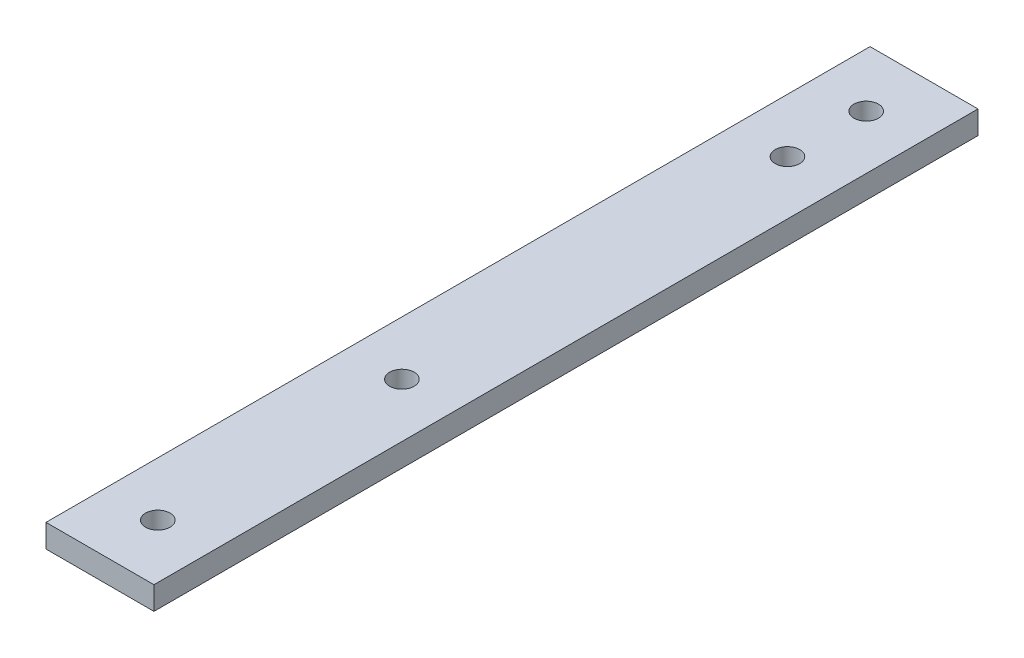
ISO-10303-21;
HEADER;
FILE_DESCRIPTION(('STEP AP214'),'2;1');
FILE_NAME('part.step','',(''),(''),'','','');
FILE_SCHEMA(('AUTOMOTIVE_DESIGN { 1 0 10303 214 1 1 1 1 }'));
ENDSEC;
DATA;
#1=APPLICATION_CONTEXT('core data for automotive mechanical design processes');
#2=APPLICATION_PROTOCOL_DEFINITION('international standard','automotive_design',2000,#1);
#3=PRODUCT_CONTEXT('',#1,'mechanical');
#4=PRODUCT('Part','Part','',(#3));
#5=PRODUCT_RELATED_PRODUCT_CATEGORY('part','',(#4));
#6=PRODUCT_DEFINITION_FORMATION('','',#4);
#7=PRODUCT_DEFINITION_CONTEXT('part definition',#1,'design');
#8=PRODUCT_DEFINITION('design','',#6,#7);
#9=PRODUCT_DEFINITION_SHAPE('','',#8);
#10=(LENGTH_UNIT() NAMED_UNIT(*) SI_UNIT(.MILLI.,.METRE.));
#11=(NAMED_UNIT(*) PLANE_ANGLE_UNIT() SI_UNIT($,.RADIAN.));
#12=(NAMED_UNIT(*) SI_UNIT($,.STERADIAN.) SOLID_ANGLE_UNIT());
#13=UNCERTAINTY_MEASURE_WITH_UNIT(LENGTH_MEASURE(1.E-05),#10,'distance_accuracy_value','');
#14=(GEOMETRIC_REPRESENTATION_CONTEXT(3) GLOBAL_UNCERTAINTY_ASSIGNED_CONTEXT((#13)) GLOBAL_UNIT_ASSIGNED_CONTEXT((#10,
#11,#12)) REPRESENTATION_CONTEXT('',''));
#15=CARTESIAN_POINT('',(0.,0.,0.));
#16=DIRECTION('',(0.,0.,1.));
#17=DIRECTION('',(1.,0.,0.));
#18=AXIS2_PLACEMENT_3D('',#15,#16,#17);
#19=CARTESIAN_POINT('',(14.,3.,0.));
#20=DIRECTION('',(0.,0.,-1.));
#21=DIRECTION('',(-1.,0.,0.));
#22=AXIS2_PLACEMENT_3D('',#19,#20,#21);
#23=PLANE('',#22);
#24=DIRECTION('',(1.,0.,0.));
#25=VECTOR('',#24,1.);
#26=CARTESIAN_POINT('',(14.,0.,0.));
#27=LINE('',#26,#25);
#28=CARTESIAN_POINT('',(0.,0.,0.));
#29=VERTEX_POINT('',#28);
#30=CARTESIAN_POINT('',(14.,0.,0.));
#31=VERTEX_POINT('',#30);
#32=EDGE_CURVE('E94',#29,#31,#27,.T.);
#33=ORIENTED_EDGE('',*,*,#32,.T.);
#34=DIRECTION('',(0.,-1.,0.));
#35=VECTOR('',#34,1.);
#36=CARTESIAN_POINT('',(14.,3.,0.));
#37=LINE('',#36,#35);
#38=CARTESIAN_POINT('',(14.,3.,0.));
#39=VERTEX_POINT('',#38);
#40=EDGE_CURVE('E11',#39,#31,#37,.T.);
#41=ORIENTED_EDGE('',*,*,#40,.F.);
#42=DIRECTION('',(1.,0.,0.));
#43=VECTOR('',#42,1.);
#44=CARTESIAN_POINT('',(14.,3.,0.));
#45=LINE('',#44,#43);
#46=CARTESIAN_POINT('',(0.,3.,0.));
#47=VERTEX_POINT('',#46);
#48=EDGE_CURVE('E82',#47,#39,#45,.T.);
#49=ORIENTED_EDGE('',*,*,#48,.F.);
#50=DIRECTION('',(0.,-1.,0.));
#51=VECTOR('',#50,1.);
#52=CARTESIAN_POINT('',(0.,3.,0.));
#53=LINE('',#52,#51);
#54=EDGE_CURVE('E90',#47,#29,#53,.T.);
#55=ORIENTED_EDGE('',*,*,#54,.T.);
#56=EDGE_LOOP('',(#33,#41,#49,#55));
#57=FACE_BOUND('',#56,.T.);
#58=ADVANCED_FACE('F31',(#57),#23,.F.);
#59=CARTESIAN_POINT('',(14.,3.,-106.86));
#60=DIRECTION('',(-1.,0.,0.));
#61=DIRECTION('',(0.,0.,1.));
#62=AXIS2_PLACEMENT_3D('',#59,#60,#61);
#63=PLANE('',#62);
#64=DIRECTION('',(0.,0.,-1.));
#65=VECTOR('',#64,1.);
#66=CARTESIAN_POINT('',(14.,0.,-106.86));
#67=LINE('',#66,#65);
#68=CARTESIAN_POINT('',(14.,0.,-106.86));
#69=VERTEX_POINT('',#68);
#70=EDGE_CURVE('E86',#31,#69,#67,.T.);
#71=ORIENTED_EDGE('',*,*,#70,.T.);
#72=DIRECTION('',(0.,-1.,0.));
#73=VECTOR('',#72,1.);
#74=CARTESIAN_POINT('',(14.,3.,-106.86));
#75=LINE('',#74,#73);
#76=CARTESIAN_POINT('',(14.,3.,-106.86));
#77=VERTEX_POINT('',#76);
#78=EDGE_CURVE('E39',#77,#69,#75,.T.);
#79=ORIENTED_EDGE('',*,*,#78,.F.);
#80=DIRECTION('',(0.,0.,-1.));
#81=VECTOR('',#80,1.);
#82=CARTESIAN_POINT('',(14.,3.,-106.86));
#83=LINE('',#82,#81);
#84=EDGE_CURVE('E77',#39,#77,#83,.T.);
#85=ORIENTED_EDGE('',*,*,#84,.F.);
#86=ORIENTED_EDGE('',*,*,#40,.T.);
#87=EDGE_LOOP('',(#71,#79,#85,#86));
#88=FACE_BOUND('',#87,.T.);
#89=ADVANCED_FACE('F85',(#88),#63,.F.);
#90=CARTESIAN_POINT('',(0.,3.,-106.86));
#91=DIRECTION('',(0.,0.,1.));
#92=DIRECTION('',(1.,0.,0.));
#93=AXIS2_PLACEMENT_3D('',#90,#91,#92);
#94=PLANE('',#93);
#95=DIRECTION('',(-1.,0.,0.));
#96=VECTOR('',#95,1.);
#97=CARTESIAN_POINT('',(0.,0.,-106.86));
#98=LINE('',#97,#96);
#99=CARTESIAN_POINT('',(0.,0.,-106.86));
#100=VERTEX_POINT('',#99);
#101=EDGE_CURVE('E64',#69,#100,#98,.T.);
#102=ORIENTED_EDGE('',*,*,#101,.T.);
#103=DIRECTION('',(0.,-1.,0.));
#104=VECTOR('',#103,1.);
#105=CARTESIAN_POINT('',(0.,3.,-106.86));
#106=LINE('',#105,#104);
#107=CARTESIAN_POINT('',(0.,3.,-106.86));
#108=VERTEX_POINT('',#107);
#109=EDGE_CURVE('E87',#108,#100,#106,.T.);
#110=ORIENTED_EDGE('',*,*,#109,.F.);
#111=DIRECTION('',(-1.,0.,0.));
#112=VECTOR('',#111,1.);
#113=CARTESIAN_POINT('',(0.,3.,-106.86));
#114=LINE('',#113,#112);
#115=EDGE_CURVE('E80',#77,#108,#114,.T.);
#116=ORIENTED_EDGE('',*,*,#115,.F.);
#117=ORIENTED_EDGE('',*,*,#78,.T.);
#118=EDGE_LOOP('',(#102,#110,#116,#117));
#119=FACE_BOUND('',#118,.T.);
#120=ADVANCED_FACE('F88',(#119),#94,.F.);
#121=CARTESIAN_POINT('',(0.,3.,0.));
#122=DIRECTION('',(1.,0.,0.));
#123=DIRECTION('',(0.,0.,-1.));
#124=AXIS2_PLACEMENT_3D('',#121,#122,#123);
#125=PLANE('',#124);
#126=DIRECTION('',(0.,0.,1.));
#127=VECTOR('',#126,1.);
#128=CARTESIAN_POINT('',(0.,0.,0.));
#129=LINE('',#128,#127);
#130=EDGE_CURVE('E70',#100,#29,#129,.T.);
#131=ORIENTED_EDGE('',*,*,#130,.T.);
#132=ORIENTED_EDGE('',*,*,#54,.F.);
#133=DIRECTION('',(0.,0.,1.));
#134=VECTOR('',#133,1.);
#135=CARTESIAN_POINT('',(0.,3.,0.));
#136=LINE('',#135,#134);
#137=EDGE_CURVE('E47',#108,#47,#136,.T.);
#138=ORIENTED_EDGE('',*,*,#137,.F.);
#139=ORIENTED_EDGE('',*,*,#109,.T.);
#140=EDGE_LOOP('',(#131,#132,#138,#139));
#141=FACE_BOUND('',#140,.T.);
#142=ADVANCED_FACE('F102',(#141),#125,.F.);
#143=CARTESIAN_POINT('',(0.,3.,0.));
#144=DIRECTION('',(0.,-1.,0.));
#145=DIRECTION('',(0.,0.,-1.));
#146=AXIS2_PLACEMENT_3D('',#143,#144,#145);
#147=PLANE('',#146);
#148=CARTESIAN_POINT('',(6.99999999999999,3.,-39.15));
#149=DIRECTION('',(0.,1.,0.));
#150=DIRECTION('',(0.,0.,1.));
#151=AXIS2_PLACEMENT_3D('',#148,#149,#150);
#152=CIRCLE('',#151,1.59);
#153=CARTESIAN_POINT('',(6.99999999999999,3.,-37.56));
#154=VERTEX_POINT('',#153);
#155=EDGE_CURVE('E128',#154,#154,#152,.T.);
#156=ORIENTED_EDGE('',*,*,#155,.F.);
#157=EDGE_LOOP('',(#156));
#158=FACE_BOUND('',#157,.T.);
#159=CARTESIAN_POINT('',(6.99999999999999,3.,-89.15));
#160=DIRECTION('',(0.,1.,0.));
#161=DIRECTION('',(0.,0.,1.));
#162=AXIS2_PLACEMENT_3D('',#159,#160,#161);
#163=CIRCLE('',#162,1.59);
#164=CARTESIAN_POINT('',(6.99999999999999,3.,-87.56));
#165=VERTEX_POINT('',#164);
#166=EDGE_CURVE('E122',#165,#165,#163,.T.);
#167=ORIENTED_EDGE('',*,*,#166,.F.);
#168=EDGE_LOOP('',(#167));
#169=FACE_BOUND('',#168,.T.);
#170=CARTESIAN_POINT('',(6.99999999999999,3.,-7.49999999999999));
#171=DIRECTION('',(0.,1.,0.));
#172=DIRECTION('',(0.,0.,-1.));
#173=AXIS2_PLACEMENT_3D('',#170,#171,#172);
#174=CIRCLE('',#173,1.59);
#175=CARTESIAN_POINT('',(6.99999999999999,3.,-9.08999999999999));
#176=VERTEX_POINT('',#175);
#177=EDGE_CURVE('E116',#176,#176,#174,.T.);
#178=ORIENTED_EDGE('',*,*,#177,.F.);
#179=EDGE_LOOP('',(#178));
#180=FACE_BOUND('',#179,.T.);
#181=CARTESIAN_POINT('',(6.99999999999999,3.,-99.36));
#182=DIRECTION('',(0.,1.,0.));
#183=DIRECTION('',(0.,0.,1.));
#184=AXIS2_PLACEMENT_3D('',#181,#182,#183);
#185=CIRCLE('',#184,1.59);
#186=CARTESIAN_POINT('',(6.99999999999999,3.,-97.77));
#187=VERTEX_POINT('',#186);
#188=EDGE_CURVE('E110',#187,#187,#185,.T.);
#189=ORIENTED_EDGE('',*,*,#188,.F.);
#190=EDGE_LOOP('',(#189));
#191=FACE_BOUND('',#190,.T.);
#192=ORIENTED_EDGE('',*,*,#48,.T.);
#193=ORIENTED_EDGE('',*,*,#84,.T.);
#194=ORIENTED_EDGE('',*,*,#115,.T.);
#195=ORIENTED_EDGE('',*,*,#137,.T.);
#196=EDGE_LOOP('',(#192,#193,#194,#195));
#197=FACE_BOUND('',#196,.T.);
#198=ADVANCED_FACE('F78',(#158,#169,#180,#191,#197),#147,.F.);
#199=CARTESIAN_POINT('',(0.,0.,0.));
#200=DIRECTION('',(0.,-1.,0.));
#201=DIRECTION('',(0.,0.,-1.));
#202=AXIS2_PLACEMENT_3D('',#199,#200,#201);
#203=PLANE('',#202);
#204=CARTESIAN_POINT('',(6.99999999999999,0.,-39.15));
#205=DIRECTION('',(0.,-1.,0.));
#206=DIRECTION('',(0.,0.,-1.));
#207=AXIS2_PLACEMENT_3D('',#204,#205,#206);
#208=CIRCLE('',#207,1.59);
#209=CARTESIAN_POINT('',(6.99999999999999,0.,-40.74));
#210=VERTEX_POINT('',#209);
#211=EDGE_CURVE('E125',#210,#210,#208,.F.);
#212=ORIENTED_EDGE('',*,*,#211,.T.);
#213=EDGE_LOOP('',(#212));
#214=FACE_BOUND('',#213,.T.);
#215=CARTESIAN_POINT('',(6.99999999999999,0.,-89.15));
#216=DIRECTION('',(0.,-1.,0.));
#217=DIRECTION('',(0.,0.,-1.));
#218=AXIS2_PLACEMENT_3D('',#215,#216,#217);
#219=CIRCLE('',#218,1.59);
#220=CARTESIAN_POINT('',(6.99999999999999,0.,-90.74));
#221=VERTEX_POINT('',#220);
#222=EDGE_CURVE('E119',#221,#221,#219,.F.);
#223=ORIENTED_EDGE('',*,*,#222,.T.);
#224=EDGE_LOOP('',(#223));
#225=FACE_BOUND('',#224,.T.);
#226=CARTESIAN_POINT('',(6.99999999999999,0.,-7.49999999999999));
#227=DIRECTION('',(0.,-1.,0.));
#228=DIRECTION('',(0.,0.,-1.));
#229=AXIS2_PLACEMENT_3D('',#226,#227,#228);
#230=CIRCLE('',#229,1.59);
#231=CARTESIAN_POINT('',(6.99999999999999,0.,-9.08999999999999));
#232=VERTEX_POINT('',#231);
#233=EDGE_CURVE('E113',#232,#232,#230,.F.);
#234=ORIENTED_EDGE('',*,*,#233,.T.);
#235=EDGE_LOOP('',(#234));
#236=FACE_BOUND('',#235,.T.);
#237=CARTESIAN_POINT('',(6.99999999999999,0.,-99.36));
#238=DIRECTION('',(0.,-1.,0.));
#239=DIRECTION('',(0.,0.,-1.));
#240=AXIS2_PLACEMENT_3D('',#237,#238,#239);
#241=CIRCLE('',#240,1.59);
#242=CARTESIAN_POINT('',(6.99999999999999,0.,-100.95));
#243=VERTEX_POINT('',#242);
#244=EDGE_CURVE('E97',#243,#243,#241,.F.);
#245=ORIENTED_EDGE('',*,*,#244,.T.);
#246=EDGE_LOOP('',(#245));
#247=FACE_BOUND('',#246,.T.);
#248=ORIENTED_EDGE('',*,*,#32,.F.);
#249=ORIENTED_EDGE('',*,*,#130,.F.);
#250=ORIENTED_EDGE('',*,*,#101,.F.);
#251=ORIENTED_EDGE('',*,*,#70,.F.);
#252=EDGE_LOOP('',(#248,#249,#250,#251));
#253=FACE_BOUND('',#252,.T.);
#254=ADVANCED_FACE('F105',(#214,#225,#236,#247,#253),#203,.T.);
#255=CARTESIAN_POINT('',(6.99999999999999,-4.49719912834644,-99.36));
#256=DIRECTION('',(0.,1.,0.));
#257=DIRECTION('',(0.,0.,1.));
#258=AXIS2_PLACEMENT_3D('',#255,#256,#257);
#259=CYLINDRICAL_SURFACE('',#258,1.59);
#260=ORIENTED_EDGE('',*,*,#188,.T.);
#261=EDGE_LOOP('',(#260));
#262=FACE_BOUND('',#261,.T.);
#263=ORIENTED_EDGE('',*,*,#244,.F.);
#264=EDGE_LOOP('',(#263));
#265=FACE_BOUND('',#264,.T.);
#266=ADVANCED_FACE('F144',(#262,#265),#259,.F.);
#267=CARTESIAN_POINT('',(6.99999999999999,-4.49719912834644,-7.49999999999999));
#268=DIRECTION('',(0.,1.,0.));
#269=DIRECTION('',(0.,0.,1.));
#270=AXIS2_PLACEMENT_3D('',#267,#268,#269);
#271=CYLINDRICAL_SURFACE('',#270,1.59);
#272=ORIENTED_EDGE('',*,*,#177,.T.);
#273=EDGE_LOOP('',(#272));
#274=FACE_BOUND('',#273,.T.);
#275=ORIENTED_EDGE('',*,*,#233,.F.);
#276=EDGE_LOOP('',(#275));
#277=FACE_BOUND('',#276,.T.);
#278=ADVANCED_FACE('F147',(#274,#277),#271,.F.);
#279=CARTESIAN_POINT('',(6.99999999999999,-4.49719912834644,-89.15));
#280=DIRECTION('',(0.,1.,0.));
#281=DIRECTION('',(0.,0.,1.));
#282=AXIS2_PLACEMENT_3D('',#279,#280,#281);
#283=CYLINDRICAL_SURFACE('',#282,1.59);
#284=ORIENTED_EDGE('',*,*,#166,.T.);
#285=EDGE_LOOP('',(#284));
#286=FACE_BOUND('',#285,.T.);
#287=ORIENTED_EDGE('',*,*,#222,.F.);
#288=EDGE_LOOP('',(#287));
#289=FACE_BOUND('',#288,.T.);
#290=ADVANCED_FACE('F194',(#286,#289),#283,.F.);
#291=CARTESIAN_POINT('',(6.99999999999999,-4.49719912834644,-39.15));
#292=DIRECTION('',(0.,1.,0.));
#293=DIRECTION('',(0.,0.,1.));
#294=AXIS2_PLACEMENT_3D('',#291,#292,#293);
#295=CYLINDRICAL_SURFACE('',#294,1.59);
#296=ORIENTED_EDGE('',*,*,#155,.T.);
#297=EDGE_LOOP('',(#296));
#298=FACE_BOUND('',#297,.T.);
#299=ORIENTED_EDGE('',*,*,#211,.F.);
#300=EDGE_LOOP('',(#299));
#301=FACE_BOUND('',#300,.T.);
#302=ADVANCED_FACE('F132',(#298,#301),#295,.F.);
#303=CLOSED_SHELL('',(#58,#89,#120,#142,#198,#254,#266,#278,#290,#302));
#304=MANIFOLD_SOLID_BREP('B2',#303);
#305=ADVANCED_BREP_SHAPE_REPRESENTATION('',(#18,#304),#14);
#306=SHAPE_DEFINITION_REPRESENTATION(#9,#305);
ENDSEC;
END-ISO-10303-21;
